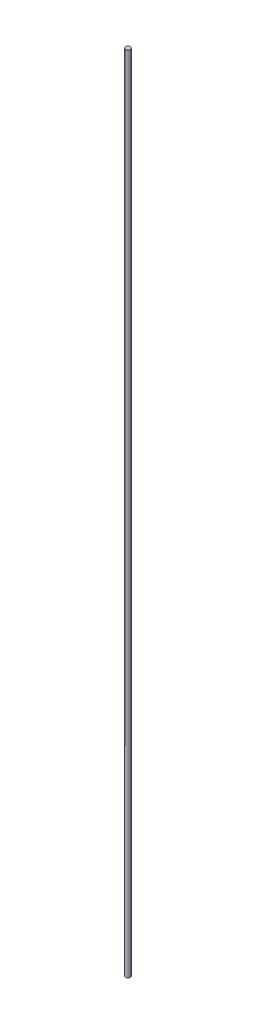
ISO-10303-21;
HEADER;
FILE_DESCRIPTION(('STEP AP214'),'2;1');
FILE_NAME('part.step','',(''),(''),'','','');
FILE_SCHEMA(('AUTOMOTIVE_DESIGN { 1 0 10303 214 1 1 1 1 }'));
ENDSEC;
DATA;
#1=APPLICATION_CONTEXT('core data for automotive mechanical design processes');
#2=APPLICATION_PROTOCOL_DEFINITION('international standard','automotive_design',2000,#1);
#3=PRODUCT_CONTEXT('',#1,'mechanical');
#4=PRODUCT('Part','Part','',(#3));
#5=PRODUCT_RELATED_PRODUCT_CATEGORY('part','',(#4));
#6=PRODUCT_DEFINITION_FORMATION('','',#4);
#7=PRODUCT_DEFINITION_CONTEXT('part definition',#1,'design');
#8=PRODUCT_DEFINITION('design','',#6,#7);
#9=PRODUCT_DEFINITION_SHAPE('','',#8);
#10=(LENGTH_UNIT() NAMED_UNIT(*) SI_UNIT(.MILLI.,.METRE.));
#11=(NAMED_UNIT(*) PLANE_ANGLE_UNIT() SI_UNIT($,.RADIAN.));
#12=(NAMED_UNIT(*) SI_UNIT($,.STERADIAN.) SOLID_ANGLE_UNIT());
#13=UNCERTAINTY_MEASURE_WITH_UNIT(LENGTH_MEASURE(1.E-05),#10,'distance_accuracy_value','');
#14=(GEOMETRIC_REPRESENTATION_CONTEXT(3) GLOBAL_UNCERTAINTY_ASSIGNED_CONTEXT((#13)) GLOBAL_UNIT_ASSIGNED_CONTEXT((#10,
#11,#12)) REPRESENTATION_CONTEXT('',''));
#15=CARTESIAN_POINT('',(0.,0.,0.));
#16=DIRECTION('',(0.,0.,1.));
#17=DIRECTION('',(1.,0.,0.));
#18=AXIS2_PLACEMENT_3D('',#15,#16,#17);
#19=CARTESIAN_POINT('',(0.,2000.,0.));
#20=DIRECTION('',(0.,-1.,0.));
#21=DIRECTION('',(0.,0.,-1.));
#22=AXIS2_PLACEMENT_3D('',#19,#20,#21);
#23=CYLINDRICAL_SURFACE('',#22,6.);
#24=CARTESIAN_POINT('',(0.,2000.,0.));
#25=DIRECTION('',(0.,1.,0.));
#26=DIRECTION('',(0.,0.,1.));
#27=AXIS2_PLACEMENT_3D('',#24,#25,#26);
#28=CIRCLE('',#27,6.);
#29=CARTESIAN_POINT('',(0.,2000.,6.));
#30=VERTEX_POINT('',#29);
#31=EDGE_CURVE('E10',#30,#30,#28,.T.);
#32=ORIENTED_EDGE('',*,*,#31,.F.);
#33=EDGE_LOOP('',(#32));
#34=FACE_BOUND('',#33,.T.);
#35=CARTESIAN_POINT('',(0.,0.,0.));
#36=DIRECTION('',(0.,1.,0.));
#37=DIRECTION('',(0.,0.,1.));
#38=AXIS2_PLACEMENT_3D('',#35,#36,#37);
#39=CIRCLE('',#38,6.);
#40=CARTESIAN_POINT('',(0.,0.,6.));
#41=VERTEX_POINT('',#40);
#42=EDGE_CURVE('E44',#41,#41,#39,.T.);
#43=ORIENTED_EDGE('',*,*,#42,.T.);
#44=EDGE_LOOP('',(#43));
#45=FACE_BOUND('',#44,.T.);
#46=ADVANCED_FACE('F41',(#34,#45),#23,.T.);
#47=CARTESIAN_POINT('',(0.,2000.,0.));
#48=DIRECTION('',(0.,1.,0.));
#49=DIRECTION('',(0.,0.,1.));
#50=AXIS2_PLACEMENT_3D('',#47,#48,#49);
#51=PLANE('',#50);
#52=ORIENTED_EDGE('',*,*,#31,.T.);
#53=EDGE_LOOP('',(#52));
#54=FACE_BOUND('',#53,.T.);
#55=ADVANCED_FACE('F56',(#54),#51,.T.);
#56=CARTESIAN_POINT('',(0.,0.,0.));
#57=DIRECTION('',(0.,1.,0.));
#58=DIRECTION('',(0.,0.,1.));
#59=AXIS2_PLACEMENT_3D('',#56,#57,#58);
#60=PLANE('',#59);
#61=ORIENTED_EDGE('',*,*,#42,.F.);
#62=EDGE_LOOP('',(#61));
#63=FACE_BOUND('',#62,.T.);
#64=ADVANCED_FACE('F54',(#63),#60,.F.);
#65=CLOSED_SHELL('',(#46,#55,#64));
#66=MANIFOLD_SOLID_BREP('B2',#65);
#67=ADVANCED_BREP_SHAPE_REPRESENTATION('',(#18,#66),#14);
#68=SHAPE_DEFINITION_REPRESENTATION(#9,#67);
ENDSEC;
END-ISO-10303-21;
